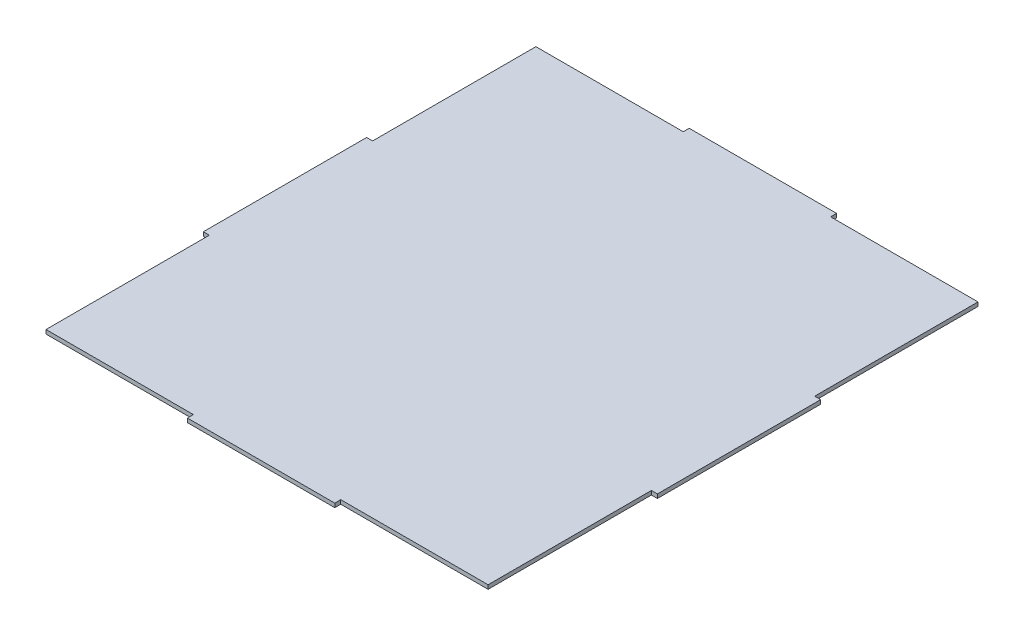
ISO-10303-21;
HEADER;
FILE_DESCRIPTION(('STEP AP214'),'2;1');
FILE_NAME('part.step','',(''),(''),'','','');
FILE_SCHEMA(('AUTOMOTIVE_DESIGN { 1 0 10303 214 1 1 1 1 }'));
ENDSEC;
DATA;
#1=APPLICATION_CONTEXT('core data for automotive mechanical design processes');
#2=APPLICATION_PROTOCOL_DEFINITION('international standard','automotive_design',2000,#1);
#3=PRODUCT_CONTEXT('',#1,'mechanical');
#4=PRODUCT('Part','Part','',(#3));
#5=PRODUCT_RELATED_PRODUCT_CATEGORY('part','',(#4));
#6=PRODUCT_DEFINITION_FORMATION('','',#4);
#7=PRODUCT_DEFINITION_CONTEXT('part definition',#1,'design');
#8=PRODUCT_DEFINITION('design','',#6,#7);
#9=PRODUCT_DEFINITION_SHAPE('','',#8);
#10=(LENGTH_UNIT() NAMED_UNIT(*) SI_UNIT(.MILLI.,.METRE.));
#11=(NAMED_UNIT(*) PLANE_ANGLE_UNIT() SI_UNIT($,.RADIAN.));
#12=(NAMED_UNIT(*) SI_UNIT($,.STERADIAN.) SOLID_ANGLE_UNIT());
#13=UNCERTAINTY_MEASURE_WITH_UNIT(LENGTH_MEASURE(1.E-05),#10,'distance_accuracy_value','');
#14=(GEOMETRIC_REPRESENTATION_CONTEXT(3) GLOBAL_UNCERTAINTY_ASSIGNED_CONTEXT((#13)) GLOBAL_UNIT_ASSIGNED_CONTEXT((#10,
#11,#12)) REPRESENTATION_CONTEXT('',''));
#15=CARTESIAN_POINT('',(0.,0.,0.));
#16=DIRECTION('',(0.,0.,1.));
#17=DIRECTION('',(1.,0.,0.));
#18=AXIS2_PLACEMENT_3D('',#15,#16,#17);
#19=CARTESIAN_POINT('',(111.,2.,-41.));
#20=DIRECTION('',(-1.,0.,0.));
#21=DIRECTION('',(0.,0.,1.));
#22=AXIS2_PLACEMENT_3D('',#19,#20,#21);
#23=PLANE('',#22);
#24=DIRECTION('',(0.,0.,-1.));
#25=VECTOR('',#24,1.);
#26=CARTESIAN_POINT('',(111.,0.,-41.));
#27=LINE('',#26,#25);
#28=CARTESIAN_POINT('',(111.,0.,-41.));
#29=VERTEX_POINT('',#28);
#30=CARTESIAN_POINT('',(111.,0.,-123.));
#31=VERTEX_POINT('',#30);
#32=EDGE_CURVE('E201',#29,#31,#27,.T.);
#33=ORIENTED_EDGE('',*,*,#32,.T.);
#34=DIRECTION('',(0.,-1.,0.));
#35=VECTOR('',#34,1.);
#36=CARTESIAN_POINT('',(111.,2.,-123.));
#37=LINE('',#36,#35);
#38=CARTESIAN_POINT('',(111.,2.,-123.));
#39=VERTEX_POINT('',#38);
#40=EDGE_CURVE('E11',#39,#31,#37,.T.);
#41=ORIENTED_EDGE('',*,*,#40,.F.);
#42=DIRECTION('',(0.,0.,-1.));
#43=VECTOR('',#42,1.);
#44=CARTESIAN_POINT('',(111.,2.,-41.));
#45=LINE('',#44,#43);
#46=CARTESIAN_POINT('',(111.,2.,-41.));
#47=VERTEX_POINT('',#46);
#48=EDGE_CURVE('E239',#47,#39,#45,.T.);
#49=ORIENTED_EDGE('',*,*,#48,.F.);
#50=DIRECTION('',(0.,-1.,0.));
#51=VECTOR('',#50,1.);
#52=CARTESIAN_POINT('',(111.,2.,-41.));
#53=LINE('',#52,#51);
#54=EDGE_CURVE('E197',#47,#29,#53,.T.);
#55=ORIENTED_EDGE('',*,*,#54,.T.);
#56=EDGE_LOOP('',(#33,#41,#49,#55));
#57=FACE_BOUND('',#56,.T.);
#58=ADVANCED_FACE('F33',(#57),#23,.F.);
#59=CARTESIAN_POINT('',(37.,2.,-123.));
#60=DIRECTION('',(0.,0.,1.));
#61=DIRECTION('',(1.,0.,0.));
#62=AXIS2_PLACEMENT_3D('',#59,#60,#61);
#63=PLANE('',#62);
#64=DIRECTION('',(-1.,0.,0.));
#65=VECTOR('',#64,1.);
#66=CARTESIAN_POINT('',(37.,0.,-123.));
#67=LINE('',#66,#65);
#68=CARTESIAN_POINT('',(37.,0.,-123.));
#69=VERTEX_POINT('',#68);
#70=EDGE_CURVE('E204',#31,#69,#67,.T.);
#71=ORIENTED_EDGE('',*,*,#70,.T.);
#72=DIRECTION('',(0.,-1.,0.));
#73=VECTOR('',#72,1.);
#74=CARTESIAN_POINT('',(37.,2.,-123.));
#75=LINE('',#74,#73);
#76=CARTESIAN_POINT('',(37.,2.,-123.));
#77=VERTEX_POINT('',#76);
#78=EDGE_CURVE('E41',#77,#69,#75,.T.);
#79=ORIENTED_EDGE('',*,*,#78,.F.);
#80=DIRECTION('',(-1.,0.,0.));
#81=VECTOR('',#80,1.);
#82=CARTESIAN_POINT('',(37.,2.,-123.));
#83=LINE('',#82,#81);
#84=EDGE_CURVE('E128',#39,#77,#83,.T.);
#85=ORIENTED_EDGE('',*,*,#84,.F.);
#86=ORIENTED_EDGE('',*,*,#40,.T.);
#87=EDGE_LOOP('',(#71,#79,#85,#86));
#88=FACE_BOUND('',#87,.T.);
#89=ADVANCED_FACE('F357',(#88),#63,.F.);
#90=CARTESIAN_POINT('',(37.,2.,-123.));
#91=DIRECTION('',(-1.,0.,0.));
#92=DIRECTION('',(0.,0.,1.));
#93=AXIS2_PLACEMENT_3D('',#90,#91,#92);
#94=PLANE('',#93);
#95=DIRECTION('',(0.,0.,-1.));
#96=VECTOR('',#95,1.);
#97=CARTESIAN_POINT('',(37.,0.,-123.));
#98=LINE('',#97,#96);
#99=CARTESIAN_POINT('',(37.,0.,-126.));
#100=VERTEX_POINT('',#99);
#101=EDGE_CURVE('E206',#69,#100,#98,.T.);
#102=ORIENTED_EDGE('',*,*,#101,.T.);
#103=DIRECTION('',(0.,-1.,0.));
#104=VECTOR('',#103,1.);
#105=CARTESIAN_POINT('',(37.,2.,-126.));
#106=LINE('',#105,#104);
#107=CARTESIAN_POINT('',(37.,2.,-126.));
#108=VERTEX_POINT('',#107);
#109=EDGE_CURVE('E282',#108,#100,#106,.T.);
#110=ORIENTED_EDGE('',*,*,#109,.F.);
#111=DIRECTION('',(0.,0.,-1.));
#112=VECTOR('',#111,1.);
#113=CARTESIAN_POINT('',(37.,2.,-123.));
#114=LINE('',#113,#112);
#115=EDGE_CURVE('E290',#77,#108,#114,.T.);
#116=ORIENTED_EDGE('',*,*,#115,.F.);
#117=ORIENTED_EDGE('',*,*,#78,.T.);
#118=EDGE_LOOP('',(#102,#110,#116,#117));
#119=FACE_BOUND('',#118,.T.);
#120=ADVANCED_FACE('F288',(#119),#94,.F.);
#121=CARTESIAN_POINT('',(-37.,2.,-126.));
#122=DIRECTION('',(0.,0.,1.));
#123=DIRECTION('',(1.,0.,0.));
#124=AXIS2_PLACEMENT_3D('',#121,#122,#123);
#125=PLANE('',#124);
#126=DIRECTION('',(-1.,0.,0.));
#127=VECTOR('',#126,1.);
#128=CARTESIAN_POINT('',(-37.,0.,-126.));
#129=LINE('',#128,#127);
#130=CARTESIAN_POINT('',(-37.,0.,-126.));
#131=VERTEX_POINT('',#130);
#132=EDGE_CURVE('E208',#100,#131,#129,.T.);
#133=ORIENTED_EDGE('',*,*,#132,.T.);
#134=DIRECTION('',(0.,-1.,0.));
#135=VECTOR('',#134,1.);
#136=CARTESIAN_POINT('',(-37.,2.,-126.));
#137=LINE('',#136,#135);
#138=CARTESIAN_POINT('',(-37.,2.,-126.));
#139=VERTEX_POINT('',#138);
#140=EDGE_CURVE('E279',#139,#131,#137,.T.);
#141=ORIENTED_EDGE('',*,*,#140,.F.);
#142=DIRECTION('',(-1.,0.,0.));
#143=VECTOR('',#142,1.);
#144=CARTESIAN_POINT('',(-37.,2.,-126.));
#145=LINE('',#144,#143);
#146=EDGE_CURVE('E308',#108,#139,#145,.T.);
#147=ORIENTED_EDGE('',*,*,#146,.F.);
#148=ORIENTED_EDGE('',*,*,#109,.T.);
#149=EDGE_LOOP('',(#133,#141,#147,#148));
#150=FACE_BOUND('',#149,.T.);
#151=ADVANCED_FACE('F299',(#150),#125,.F.);
#152=CARTESIAN_POINT('',(-37.,2.,-123.));
#153=DIRECTION('',(1.,0.,0.));
#154=DIRECTION('',(0.,0.,-1.));
#155=AXIS2_PLACEMENT_3D('',#152,#153,#154);
#156=PLANE('',#155);
#157=DIRECTION('',(0.,0.,1.));
#158=VECTOR('',#157,1.);
#159=CARTESIAN_POINT('',(-37.,0.,-123.));
#160=LINE('',#159,#158);
#161=CARTESIAN_POINT('',(-37.,0.,-123.));
#162=VERTEX_POINT('',#161);
#163=EDGE_CURVE('E210',#131,#162,#160,.T.);
#164=ORIENTED_EDGE('',*,*,#163,.T.);
#165=DIRECTION('',(0.,-1.,0.));
#166=VECTOR('',#165,1.);
#167=CARTESIAN_POINT('',(-37.,2.,-123.));
#168=LINE('',#167,#166);
#169=CARTESIAN_POINT('',(-37.,2.,-123.));
#170=VERTEX_POINT('',#169);
#171=EDGE_CURVE('E276',#170,#162,#168,.T.);
#172=ORIENTED_EDGE('',*,*,#171,.F.);
#173=DIRECTION('',(0.,0.,1.));
#174=VECTOR('',#173,1.);
#175=CARTESIAN_POINT('',(-37.,2.,-123.));
#176=LINE('',#175,#174);
#177=EDGE_CURVE('E305',#139,#170,#176,.T.);
#178=ORIENTED_EDGE('',*,*,#177,.F.);
#179=ORIENTED_EDGE('',*,*,#140,.T.);
#180=EDGE_LOOP('',(#164,#172,#178,#179));
#181=FACE_BOUND('',#180,.T.);
#182=ADVANCED_FACE('F303',(#181),#156,.F.);
#183=CARTESIAN_POINT('',(-111.,2.,-123.));
#184=DIRECTION('',(0.,0.,1.));
#185=DIRECTION('',(1.,0.,0.));
#186=AXIS2_PLACEMENT_3D('',#183,#184,#185);
#187=PLANE('',#186);
#188=DIRECTION('',(-1.,0.,0.));
#189=VECTOR('',#188,1.);
#190=CARTESIAN_POINT('',(-111.,0.,-123.));
#191=LINE('',#190,#189);
#192=CARTESIAN_POINT('',(-111.,0.,-123.));
#193=VERTEX_POINT('',#192);
#194=EDGE_CURVE('E212',#162,#193,#191,.T.);
#195=ORIENTED_EDGE('',*,*,#194,.T.);
#196=DIRECTION('',(0.,-1.,0.));
#197=VECTOR('',#196,1.);
#198=CARTESIAN_POINT('',(-111.,2.,-123.));
#199=LINE('',#198,#197);
#200=CARTESIAN_POINT('',(-111.,2.,-123.));
#201=VERTEX_POINT('',#200);
#202=EDGE_CURVE('E273',#201,#193,#199,.T.);
#203=ORIENTED_EDGE('',*,*,#202,.F.);
#204=DIRECTION('',(-1.,0.,0.));
#205=VECTOR('',#204,1.);
#206=CARTESIAN_POINT('',(-111.,2.,-123.));
#207=LINE('',#206,#205);
#208=EDGE_CURVE('E307',#170,#201,#207,.T.);
#209=ORIENTED_EDGE('',*,*,#208,.F.);
#210=ORIENTED_EDGE('',*,*,#171,.T.);
#211=EDGE_LOOP('',(#195,#203,#209,#210));
#212=FACE_BOUND('',#211,.T.);
#213=ADVANCED_FACE('F370',(#212),#187,.F.);
#214=CARTESIAN_POINT('',(-111.,2.,-41.));
#215=DIRECTION('',(1.,0.,0.));
#216=DIRECTION('',(0.,0.,-1.));
#217=AXIS2_PLACEMENT_3D('',#214,#215,#216);
#218=PLANE('',#217);
#219=DIRECTION('',(0.,0.,1.));
#220=VECTOR('',#219,1.);
#221=CARTESIAN_POINT('',(-111.,0.,-41.));
#222=LINE('',#221,#220);
#223=CARTESIAN_POINT('',(-111.,0.,-41.));
#224=VERTEX_POINT('',#223);
#225=EDGE_CURVE('E214',#193,#224,#222,.T.);
#226=ORIENTED_EDGE('',*,*,#225,.T.);
#227=DIRECTION('',(0.,-1.,0.));
#228=VECTOR('',#227,1.);
#229=CARTESIAN_POINT('',(-111.,2.,-41.));
#230=LINE('',#229,#228);
#231=CARTESIAN_POINT('',(-111.,2.,-41.));
#232=VERTEX_POINT('',#231);
#233=EDGE_CURVE('E270',#232,#224,#230,.T.);
#234=ORIENTED_EDGE('',*,*,#233,.F.);
#235=DIRECTION('',(0.,0.,1.));
#236=VECTOR('',#235,1.);
#237=CARTESIAN_POINT('',(-111.,2.,-41.));
#238=LINE('',#237,#236);
#239=EDGE_CURVE('E310',#201,#232,#238,.T.);
#240=ORIENTED_EDGE('',*,*,#239,.F.);
#241=ORIENTED_EDGE('',*,*,#202,.T.);
#242=EDGE_LOOP('',(#226,#234,#240,#241));
#243=FACE_BOUND('',#242,.T.);
#244=ADVANCED_FACE('F373',(#243),#218,.F.);
#245=CARTESIAN_POINT('',(-111.,2.,-41.));
#246=DIRECTION('',(0.,0.,1.));
#247=DIRECTION('',(1.,0.,0.));
#248=AXIS2_PLACEMENT_3D('',#245,#246,#247);
#249=PLANE('',#248);
#250=DIRECTION('',(-1.,0.,0.));
#251=VECTOR('',#250,1.);
#252=CARTESIAN_POINT('',(-111.,0.,-41.));
#253=LINE('',#252,#251);
#254=CARTESIAN_POINT('',(-114.,0.,-41.));
#255=VERTEX_POINT('',#254);
#256=EDGE_CURVE('E216',#224,#255,#253,.T.);
#257=ORIENTED_EDGE('',*,*,#256,.T.);
#258=DIRECTION('',(0.,-1.,0.));
#259=VECTOR('',#258,1.);
#260=CARTESIAN_POINT('',(-114.,2.,-41.));
#261=LINE('',#260,#259);
#262=CARTESIAN_POINT('',(-114.,2.,-41.));
#263=VERTEX_POINT('',#262);
#264=EDGE_CURVE('E267',#263,#255,#261,.T.);
#265=ORIENTED_EDGE('',*,*,#264,.F.);
#266=DIRECTION('',(-1.,0.,0.));
#267=VECTOR('',#266,1.);
#268=CARTESIAN_POINT('',(-111.,2.,-41.));
#269=LINE('',#268,#267);
#270=EDGE_CURVE('E316',#232,#263,#269,.T.);
#271=ORIENTED_EDGE('',*,*,#270,.F.);
#272=ORIENTED_EDGE('',*,*,#233,.T.);
#273=EDGE_LOOP('',(#257,#265,#271,#272));
#274=FACE_BOUND('',#273,.T.);
#275=ADVANCED_FACE('F377',(#274),#249,.F.);
#276=CARTESIAN_POINT('',(-114.,2.,-41.));
#277=DIRECTION('',(1.,0.,0.));
#278=DIRECTION('',(0.,0.,-1.));
#279=AXIS2_PLACEMENT_3D('',#276,#277,#278);
#280=PLANE('',#279);
#281=DIRECTION('',(0.,0.,1.));
#282=VECTOR('',#281,1.);
#283=CARTESIAN_POINT('',(-114.,0.,-41.));
#284=LINE('',#283,#282);
#285=CARTESIAN_POINT('',(-114.,0.,41.));
#286=VERTEX_POINT('',#285);
#287=EDGE_CURVE('E218',#255,#286,#284,.T.);
#288=ORIENTED_EDGE('',*,*,#287,.T.);
#289=DIRECTION('',(0.,-1.,0.));
#290=VECTOR('',#289,1.);
#291=CARTESIAN_POINT('',(-114.,2.,41.));
#292=LINE('',#291,#290);
#293=CARTESIAN_POINT('',(-114.,2.,41.));
#294=VERTEX_POINT('',#293);
#295=EDGE_CURVE('E264',#294,#286,#292,.T.);
#296=ORIENTED_EDGE('',*,*,#295,.F.);
#297=DIRECTION('',(0.,0.,1.));
#298=VECTOR('',#297,1.);
#299=CARTESIAN_POINT('',(-114.,2.,-41.));
#300=LINE('',#299,#298);
#301=EDGE_CURVE('E318',#263,#294,#300,.T.);
#302=ORIENTED_EDGE('',*,*,#301,.F.);
#303=ORIENTED_EDGE('',*,*,#264,.T.);
#304=EDGE_LOOP('',(#288,#296,#302,#303));
#305=FACE_BOUND('',#304,.T.);
#306=ADVANCED_FACE('F381',(#305),#280,.F.);
#307=CARTESIAN_POINT('',(-111.,2.,41.));
#308=DIRECTION('',(0.,0.,-1.));
#309=DIRECTION('',(-1.,0.,0.));
#310=AXIS2_PLACEMENT_3D('',#307,#308,#309);
#311=PLANE('',#310);
#312=DIRECTION('',(1.,0.,0.));
#313=VECTOR('',#312,1.);
#314=CARTESIAN_POINT('',(-111.,0.,41.));
#315=LINE('',#314,#313);
#316=CARTESIAN_POINT('',(-111.,0.,41.));
#317=VERTEX_POINT('',#316);
#318=EDGE_CURVE('E220',#286,#317,#315,.T.);
#319=ORIENTED_EDGE('',*,*,#318,.T.);
#320=DIRECTION('',(0.,-1.,0.));
#321=VECTOR('',#320,1.);
#322=CARTESIAN_POINT('',(-111.,2.,41.));
#323=LINE('',#322,#321);
#324=CARTESIAN_POINT('',(-111.,2.,41.));
#325=VERTEX_POINT('',#324);
#326=EDGE_CURVE('E261',#325,#317,#323,.T.);
#327=ORIENTED_EDGE('',*,*,#326,.F.);
#328=DIRECTION('',(1.,0.,0.));
#329=VECTOR('',#328,1.);
#330=CARTESIAN_POINT('',(-111.,2.,41.));
#331=LINE('',#330,#329);
#332=EDGE_CURVE('E320',#294,#325,#331,.T.);
#333=ORIENTED_EDGE('',*,*,#332,.F.);
#334=ORIENTED_EDGE('',*,*,#295,.T.);
#335=EDGE_LOOP('',(#319,#327,#333,#334));
#336=FACE_BOUND('',#335,.T.);
#337=ADVANCED_FACE('F385',(#336),#311,.F.);
#338=CARTESIAN_POINT('',(-111.,2.,123.));
#339=DIRECTION('',(1.,0.,0.));
#340=DIRECTION('',(0.,0.,-1.));
#341=AXIS2_PLACEMENT_3D('',#338,#339,#340);
#342=PLANE('',#341);
#343=DIRECTION('',(0.,0.,1.));
#344=VECTOR('',#343,1.);
#345=CARTESIAN_POINT('',(-111.,0.,123.));
#346=LINE('',#345,#344);
#347=CARTESIAN_POINT('',(-111.,0.,123.));
#348=VERTEX_POINT('',#347);
#349=EDGE_CURVE('E222',#317,#348,#346,.T.);
#350=ORIENTED_EDGE('',*,*,#349,.T.);
#351=DIRECTION('',(0.,-1.,0.));
#352=VECTOR('',#351,1.);
#353=CARTESIAN_POINT('',(-111.,2.,123.));
#354=LINE('',#353,#352);
#355=CARTESIAN_POINT('',(-111.,2.,123.));
#356=VERTEX_POINT('',#355);
#357=EDGE_CURVE('E258',#356,#348,#354,.T.);
#358=ORIENTED_EDGE('',*,*,#357,.F.);
#359=DIRECTION('',(0.,0.,1.));
#360=VECTOR('',#359,1.);
#361=CARTESIAN_POINT('',(-111.,2.,123.));
#362=LINE('',#361,#360);
#363=EDGE_CURVE('E322',#325,#356,#362,.T.);
#364=ORIENTED_EDGE('',*,*,#363,.F.);
#365=ORIENTED_EDGE('',*,*,#326,.T.);
#366=EDGE_LOOP('',(#350,#358,#364,#365));
#367=FACE_BOUND('',#366,.T.);
#368=ADVANCED_FACE('F389',(#367),#342,.F.);
#369=CARTESIAN_POINT('',(-111.,2.,123.));
#370=DIRECTION('',(0.,0.,-1.));
#371=DIRECTION('',(-1.,0.,0.));
#372=AXIS2_PLACEMENT_3D('',#369,#370,#371);
#373=PLANE('',#372);
#374=DIRECTION('',(1.,0.,0.));
#375=VECTOR('',#374,1.);
#376=CARTESIAN_POINT('',(-111.,0.,123.));
#377=LINE('',#376,#375);
#378=CARTESIAN_POINT('',(-37.,0.,123.));
#379=VERTEX_POINT('',#378);
#380=EDGE_CURVE('E224',#348,#379,#377,.T.);
#381=ORIENTED_EDGE('',*,*,#380,.T.);
#382=DIRECTION('',(0.,-1.,0.));
#383=VECTOR('',#382,1.);
#384=CARTESIAN_POINT('',(-37.,2.,123.));
#385=LINE('',#384,#383);
#386=CARTESIAN_POINT('',(-37.,2.,123.));
#387=VERTEX_POINT('',#386);
#388=EDGE_CURVE('E255',#387,#379,#385,.T.);
#389=ORIENTED_EDGE('',*,*,#388,.F.);
#390=DIRECTION('',(1.,0.,0.));
#391=VECTOR('',#390,1.);
#392=CARTESIAN_POINT('',(-111.,2.,123.));
#393=LINE('',#392,#391);
#394=EDGE_CURVE('E324',#356,#387,#393,.T.);
#395=ORIENTED_EDGE('',*,*,#394,.F.);
#396=ORIENTED_EDGE('',*,*,#357,.T.);
#397=EDGE_LOOP('',(#381,#389,#395,#396));
#398=FACE_BOUND('',#397,.T.);
#399=ADVANCED_FACE('F393',(#398),#373,.F.);
#400=CARTESIAN_POINT('',(-37.,2.,123.));
#401=DIRECTION('',(1.,0.,0.));
#402=DIRECTION('',(0.,0.,-1.));
#403=AXIS2_PLACEMENT_3D('',#400,#401,#402);
#404=PLANE('',#403);
#405=DIRECTION('',(0.,0.,1.));
#406=VECTOR('',#405,1.);
#407=CARTESIAN_POINT('',(-37.,0.,123.));
#408=LINE('',#407,#406);
#409=CARTESIAN_POINT('',(-37.,0.,126.));
#410=VERTEX_POINT('',#409);
#411=EDGE_CURVE('E226',#379,#410,#408,.T.);
#412=ORIENTED_EDGE('',*,*,#411,.T.);
#413=DIRECTION('',(0.,-1.,0.));
#414=VECTOR('',#413,1.);
#415=CARTESIAN_POINT('',(-37.,2.,126.));
#416=LINE('',#415,#414);
#417=CARTESIAN_POINT('',(-37.,2.,126.));
#418=VERTEX_POINT('',#417);
#419=EDGE_CURVE('E252',#418,#410,#416,.T.);
#420=ORIENTED_EDGE('',*,*,#419,.F.);
#421=DIRECTION('',(0.,0.,1.));
#422=VECTOR('',#421,1.);
#423=CARTESIAN_POINT('',(-37.,2.,123.));
#424=LINE('',#423,#422);
#425=EDGE_CURVE('E326',#387,#418,#424,.T.);
#426=ORIENTED_EDGE('',*,*,#425,.F.);
#427=ORIENTED_EDGE('',*,*,#388,.T.);
#428=EDGE_LOOP('',(#412,#420,#426,#427));
#429=FACE_BOUND('',#428,.T.);
#430=ADVANCED_FACE('F397',(#429),#404,.F.);
#431=CARTESIAN_POINT('',(-37.,2.,126.));
#432=DIRECTION('',(0.,0.,-1.));
#433=DIRECTION('',(-1.,0.,0.));
#434=AXIS2_PLACEMENT_3D('',#431,#432,#433);
#435=PLANE('',#434);
#436=DIRECTION('',(1.,0.,0.));
#437=VECTOR('',#436,1.);
#438=CARTESIAN_POINT('',(-37.,0.,126.));
#439=LINE('',#438,#437);
#440=CARTESIAN_POINT('',(37.,0.,126.));
#441=VERTEX_POINT('',#440);
#442=EDGE_CURVE('E228',#410,#441,#439,.T.);
#443=ORIENTED_EDGE('',*,*,#442,.T.);
#444=DIRECTION('',(0.,-1.,0.));
#445=VECTOR('',#444,1.);
#446=CARTESIAN_POINT('',(37.,2.,126.));
#447=LINE('',#446,#445);
#448=CARTESIAN_POINT('',(37.,2.,126.));
#449=VERTEX_POINT('',#448);
#450=EDGE_CURVE('E249',#449,#441,#447,.T.);
#451=ORIENTED_EDGE('',*,*,#450,.F.);
#452=DIRECTION('',(1.,0.,0.));
#453=VECTOR('',#452,1.);
#454=CARTESIAN_POINT('',(-37.,2.,126.));
#455=LINE('',#454,#453);
#456=EDGE_CURVE('E328',#418,#449,#455,.T.);
#457=ORIENTED_EDGE('',*,*,#456,.F.);
#458=ORIENTED_EDGE('',*,*,#419,.T.);
#459=EDGE_LOOP('',(#443,#451,#457,#458));
#460=FACE_BOUND('',#459,.T.);
#461=ADVANCED_FACE('F401',(#460),#435,.F.);
#462=CARTESIAN_POINT('',(37.,2.,123.));
#463=DIRECTION('',(-1.,0.,0.));
#464=DIRECTION('',(0.,0.,1.));
#465=AXIS2_PLACEMENT_3D('',#462,#463,#464);
#466=PLANE('',#465);
#467=DIRECTION('',(0.,0.,-1.));
#468=VECTOR('',#467,1.);
#469=CARTESIAN_POINT('',(37.,0.,123.));
#470=LINE('',#469,#468);
#471=CARTESIAN_POINT('',(37.,0.,123.));
#472=VERTEX_POINT('',#471);
#473=EDGE_CURVE('E230',#441,#472,#470,.T.);
#474=ORIENTED_EDGE('',*,*,#473,.T.);
#475=DIRECTION('',(0.,-1.,0.));
#476=VECTOR('',#475,1.);
#477=CARTESIAN_POINT('',(37.,2.,123.));
#478=LINE('',#477,#476);
#479=CARTESIAN_POINT('',(37.,2.,123.));
#480=VERTEX_POINT('',#479);
#481=EDGE_CURVE('E246',#480,#472,#478,.T.);
#482=ORIENTED_EDGE('',*,*,#481,.F.);
#483=DIRECTION('',(0.,0.,-1.));
#484=VECTOR('',#483,1.);
#485=CARTESIAN_POINT('',(37.,2.,123.));
#486=LINE('',#485,#484);
#487=EDGE_CURVE('E330',#449,#480,#486,.T.);
#488=ORIENTED_EDGE('',*,*,#487,.F.);
#489=ORIENTED_EDGE('',*,*,#450,.T.);
#490=EDGE_LOOP('',(#474,#482,#488,#489));
#491=FACE_BOUND('',#490,.T.);
#492=ADVANCED_FACE('F405',(#491),#466,.F.);
#493=CARTESIAN_POINT('',(37.,2.,123.));
#494=DIRECTION('',(0.,0.,-1.));
#495=DIRECTION('',(-1.,0.,0.));
#496=AXIS2_PLACEMENT_3D('',#493,#494,#495);
#497=PLANE('',#496);
#498=DIRECTION('',(1.,0.,0.));
#499=VECTOR('',#498,1.);
#500=CARTESIAN_POINT('',(37.,0.,123.));
#501=LINE('',#500,#499);
#502=CARTESIAN_POINT('',(111.,0.,123.));
#503=VERTEX_POINT('',#502);
#504=EDGE_CURVE('E232',#472,#503,#501,.T.);
#505=ORIENTED_EDGE('',*,*,#504,.T.);
#506=DIRECTION('',(0.,-1.,0.));
#507=VECTOR('',#506,1.);
#508=CARTESIAN_POINT('',(111.,2.,123.));
#509=LINE('',#508,#507);
#510=CARTESIAN_POINT('',(111.,2.,123.));
#511=VERTEX_POINT('',#510);
#512=EDGE_CURVE('E243',#511,#503,#509,.T.);
#513=ORIENTED_EDGE('',*,*,#512,.F.);
#514=DIRECTION('',(1.,0.,0.));
#515=VECTOR('',#514,1.);
#516=CARTESIAN_POINT('',(37.,2.,123.));
#517=LINE('',#516,#515);
#518=EDGE_CURVE('E332',#480,#511,#517,.T.);
#519=ORIENTED_EDGE('',*,*,#518,.F.);
#520=ORIENTED_EDGE('',*,*,#481,.T.);
#521=EDGE_LOOP('',(#505,#513,#519,#520));
#522=FACE_BOUND('',#521,.T.);
#523=ADVANCED_FACE('F338',(#522),#497,.F.);
#524=CARTESIAN_POINT('',(111.,2.,123.));
#525=DIRECTION('',(-1.,0.,0.));
#526=DIRECTION('',(0.,0.,1.));
#527=AXIS2_PLACEMENT_3D('',#524,#525,#526);
#528=PLANE('',#527);
#529=DIRECTION('',(0.,0.,-1.));
#530=VECTOR('',#529,1.);
#531=CARTESIAN_POINT('',(111.,0.,123.));
#532=LINE('',#531,#530);
#533=CARTESIAN_POINT('',(111.,0.,41.));
#534=VERTEX_POINT('',#533);
#535=EDGE_CURVE('E234',#503,#534,#532,.T.);
#536=ORIENTED_EDGE('',*,*,#535,.T.);
#537=DIRECTION('',(0.,-1.,0.));
#538=VECTOR('',#537,1.);
#539=CARTESIAN_POINT('',(111.,2.,41.));
#540=LINE('',#539,#538);
#541=CARTESIAN_POINT('',(111.,2.,41.));
#542=VERTEX_POINT('',#541);
#543=EDGE_CURVE('E192',#542,#534,#540,.T.);
#544=ORIENTED_EDGE('',*,*,#543,.F.);
#545=DIRECTION('',(0.,0.,-1.));
#546=VECTOR('',#545,1.);
#547=CARTESIAN_POINT('',(111.,2.,123.));
#548=LINE('',#547,#546);
#549=EDGE_CURVE('E183',#511,#542,#548,.T.);
#550=ORIENTED_EDGE('',*,*,#549,.F.);
#551=ORIENTED_EDGE('',*,*,#512,.T.);
#552=EDGE_LOOP('',(#536,#544,#550,#551));
#553=FACE_BOUND('',#552,.T.);
#554=ADVANCED_FACE('F342',(#553),#528,.F.);
#555=CARTESIAN_POINT('',(111.,2.,41.));
#556=DIRECTION('',(0.,0.,-1.));
#557=DIRECTION('',(-1.,0.,0.));
#558=AXIS2_PLACEMENT_3D('',#555,#556,#557);
#559=PLANE('',#558);
#560=DIRECTION('',(1.,0.,0.));
#561=VECTOR('',#560,1.);
#562=CARTESIAN_POINT('',(111.,0.,41.));
#563=LINE('',#562,#561);
#564=CARTESIAN_POINT('',(114.,0.,41.));
#565=VERTEX_POINT('',#564);
#566=EDGE_CURVE('E191',#534,#565,#563,.T.);
#567=ORIENTED_EDGE('',*,*,#566,.T.);
#568=DIRECTION('',(0.,-1.,0.));
#569=VECTOR('',#568,1.);
#570=CARTESIAN_POINT('',(114.,2.,41.));
#571=LINE('',#570,#569);
#572=CARTESIAN_POINT('',(114.,2.,41.));
#573=VERTEX_POINT('',#572);
#574=EDGE_CURVE('E188',#573,#565,#571,.T.);
#575=ORIENTED_EDGE('',*,*,#574,.F.);
#576=DIRECTION('',(1.,0.,0.));
#577=VECTOR('',#576,1.);
#578=CARTESIAN_POINT('',(111.,2.,41.));
#579=LINE('',#578,#577);
#580=EDGE_CURVE('E177',#542,#573,#579,.T.);
#581=ORIENTED_EDGE('',*,*,#580,.F.);
#582=ORIENTED_EDGE('',*,*,#543,.T.);
#583=EDGE_LOOP('',(#567,#575,#581,#582));
#584=FACE_BOUND('',#583,.T.);
#585=ADVANCED_FACE('F189',(#584),#559,.F.);
#586=CARTESIAN_POINT('',(114.,2.,41.));
#587=DIRECTION('',(-1.,0.,0.));
#588=DIRECTION('',(0.,0.,1.));
#589=AXIS2_PLACEMENT_3D('',#586,#587,#588);
#590=PLANE('',#589);
#591=DIRECTION('',(0.,0.,-1.));
#592=VECTOR('',#591,1.);
#593=CARTESIAN_POINT('',(114.,0.,41.));
#594=LINE('',#593,#592);
#595=CARTESIAN_POINT('',(114.,0.,-41.));
#596=VERTEX_POINT('',#595);
#597=EDGE_CURVE('E114',#565,#596,#594,.T.);
#598=ORIENTED_EDGE('',*,*,#597,.T.);
#599=DIRECTION('',(0.,-1.,0.));
#600=VECTOR('',#599,1.);
#601=CARTESIAN_POINT('',(114.,2.,-41.));
#602=LINE('',#601,#600);
#603=CARTESIAN_POINT('',(114.,2.,-41.));
#604=VERTEX_POINT('',#603);
#605=EDGE_CURVE('E193',#604,#596,#602,.T.);
#606=ORIENTED_EDGE('',*,*,#605,.F.);
#607=DIRECTION('',(0.,0.,-1.));
#608=VECTOR('',#607,1.);
#609=CARTESIAN_POINT('',(114.,2.,41.));
#610=LINE('',#609,#608);
#611=EDGE_CURVE('E181',#573,#604,#610,.T.);
#612=ORIENTED_EDGE('',*,*,#611,.F.);
#613=ORIENTED_EDGE('',*,*,#574,.T.);
#614=EDGE_LOOP('',(#598,#606,#612,#613));
#615=FACE_BOUND('',#614,.T.);
#616=ADVANCED_FACE('F195',(#615),#590,.F.);
#617=CARTESIAN_POINT('',(111.,2.,-41.));
#618=DIRECTION('',(0.,0.,1.));
#619=DIRECTION('',(1.,0.,0.));
#620=AXIS2_PLACEMENT_3D('',#617,#618,#619);
#621=PLANE('',#620);
#622=DIRECTION('',(-1.,0.,0.));
#623=VECTOR('',#622,1.);
#624=CARTESIAN_POINT('',(111.,0.,-41.));
#625=LINE('',#624,#623);
#626=EDGE_CURVE('E120',#596,#29,#625,.T.);
#627=ORIENTED_EDGE('',*,*,#626,.T.);
#628=ORIENTED_EDGE('',*,*,#54,.F.);
#629=DIRECTION('',(-1.,0.,0.));
#630=VECTOR('',#629,1.);
#631=CARTESIAN_POINT('',(111.,2.,-41.));
#632=LINE('',#631,#630);
#633=EDGE_CURVE('E49',#604,#47,#632,.T.);
#634=ORIENTED_EDGE('',*,*,#633,.F.);
#635=ORIENTED_EDGE('',*,*,#605,.T.);
#636=EDGE_LOOP('',(#627,#628,#634,#635));
#637=FACE_BOUND('',#636,.T.);
#638=ADVANCED_FACE('F346',(#637),#621,.F.);
#639=CARTESIAN_POINT('',(0.,2.,0.));
#640=DIRECTION('',(0.,-1.,0.));
#641=DIRECTION('',(0.,0.,-1.));
#642=AXIS2_PLACEMENT_3D('',#639,#640,#641);
#643=PLANE('',#642);
#644=ORIENTED_EDGE('',*,*,#48,.T.);
#645=ORIENTED_EDGE('',*,*,#84,.T.);
#646=ORIENTED_EDGE('',*,*,#115,.T.);
#647=ORIENTED_EDGE('',*,*,#146,.T.);
#648=ORIENTED_EDGE('',*,*,#177,.T.);
#649=ORIENTED_EDGE('',*,*,#208,.T.);
#650=ORIENTED_EDGE('',*,*,#239,.T.);
#651=ORIENTED_EDGE('',*,*,#270,.T.);
#652=ORIENTED_EDGE('',*,*,#301,.T.);
#653=ORIENTED_EDGE('',*,*,#332,.T.);
#654=ORIENTED_EDGE('',*,*,#363,.T.);
#655=ORIENTED_EDGE('',*,*,#394,.T.);
#656=ORIENTED_EDGE('',*,*,#425,.T.);
#657=ORIENTED_EDGE('',*,*,#456,.T.);
#658=ORIENTED_EDGE('',*,*,#487,.T.);
#659=ORIENTED_EDGE('',*,*,#518,.T.);
#660=ORIENTED_EDGE('',*,*,#549,.T.);
#661=ORIENTED_EDGE('',*,*,#580,.T.);
#662=ORIENTED_EDGE('',*,*,#611,.T.);
#663=ORIENTED_EDGE('',*,*,#633,.T.);
#664=EDGE_LOOP('',(#644,#645,#646,#647,#648,#649,#650,#651,#652,#653,#654,#655,#656,#657,#658,
#659,#660,#661,#662,#663));
#665=FACE_BOUND('',#664,.T.);
#666=ADVANCED_FACE('F179',(#665),#643,.F.);
#667=CARTESIAN_POINT('',(0.,0.,0.));
#668=DIRECTION('',(0.,-1.,0.));
#669=DIRECTION('',(0.,0.,-1.));
#670=AXIS2_PLACEMENT_3D('',#667,#668,#669);
#671=PLANE('',#670);
#672=ORIENTED_EDGE('',*,*,#32,.F.);
#673=ORIENTED_EDGE('',*,*,#626,.F.);
#674=ORIENTED_EDGE('',*,*,#597,.F.);
#675=ORIENTED_EDGE('',*,*,#566,.F.);
#676=ORIENTED_EDGE('',*,*,#535,.F.);
#677=ORIENTED_EDGE('',*,*,#504,.F.);
#678=ORIENTED_EDGE('',*,*,#473,.F.);
#679=ORIENTED_EDGE('',*,*,#442,.F.);
#680=ORIENTED_EDGE('',*,*,#411,.F.);
#681=ORIENTED_EDGE('',*,*,#380,.F.);
#682=ORIENTED_EDGE('',*,*,#349,.F.);
#683=ORIENTED_EDGE('',*,*,#318,.F.);
#684=ORIENTED_EDGE('',*,*,#287,.F.);
#685=ORIENTED_EDGE('',*,*,#256,.F.);
#686=ORIENTED_EDGE('',*,*,#225,.F.);
#687=ORIENTED_EDGE('',*,*,#194,.F.);
#688=ORIENTED_EDGE('',*,*,#163,.F.);
#689=ORIENTED_EDGE('',*,*,#132,.F.);
#690=ORIENTED_EDGE('',*,*,#101,.F.);
#691=ORIENTED_EDGE('',*,*,#70,.F.);
#692=EDGE_LOOP('',(#672,#673,#674,#675,#676,#677,#678,#679,#680,#681,#682,#683,#684,#685,#686,
#687,#688,#689,#690,#691));
#693=FACE_BOUND('',#692,.T.);
#694=ADVANCED_FACE('F294',(#693),#671,.T.);
#695=CLOSED_SHELL('',(#58,#89,#120,#151,#182,#213,#244,#275,#306,#337,#368,#399,#430,#461,#492,
#523,#554,#585,#616,#638,#666,#694));
#696=MANIFOLD_SOLID_BREP('B2',#695);
#697=ADVANCED_BREP_SHAPE_REPRESENTATION('',(#18,#696),#14);
#698=SHAPE_DEFINITION_REPRESENTATION(#9,#697);
ENDSEC;
END-ISO-10303-21;
